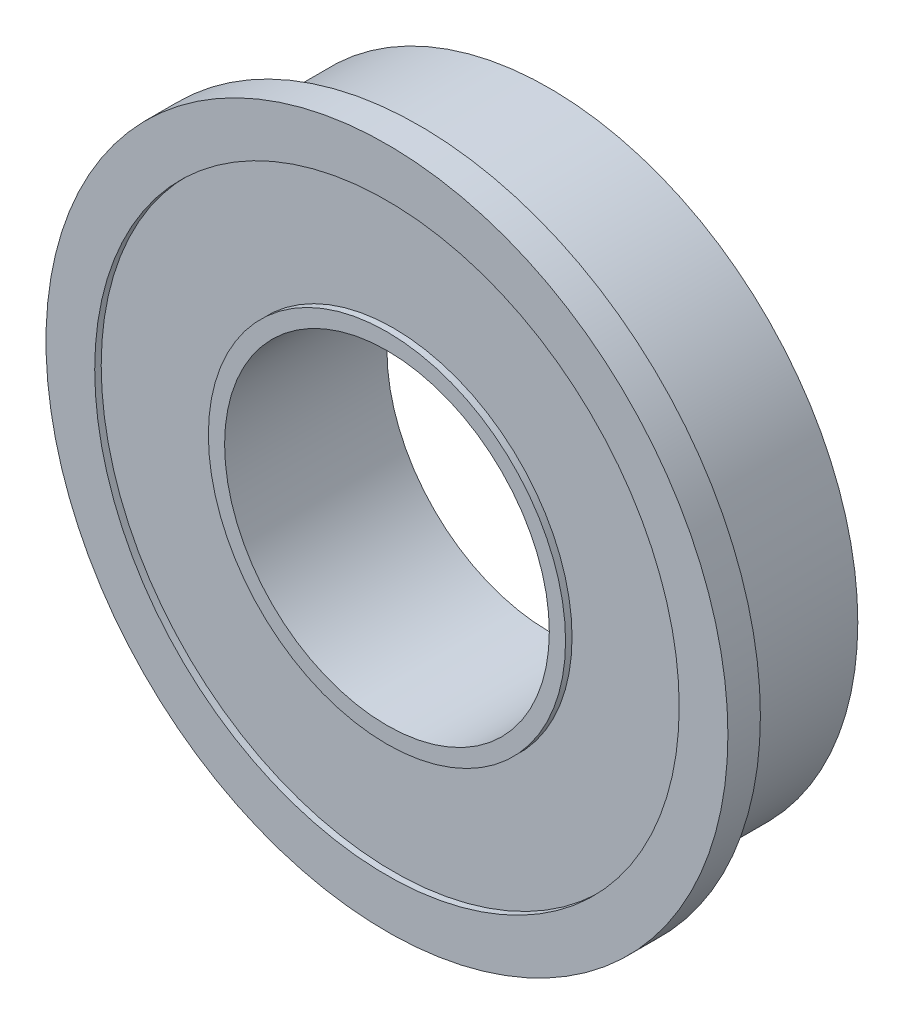
ISO-10303-21;
HEADER;
FILE_DESCRIPTION(('STEP AP214'),'2;1');
FILE_NAME('part.step','',(''),(''),'','','');
FILE_SCHEMA(('AUTOMOTIVE_DESIGN { 1 0 10303 214 1 1 1 1 }'));
ENDSEC;
DATA;
#1=APPLICATION_CONTEXT('core data for automotive mechanical design processes');
#2=APPLICATION_PROTOCOL_DEFINITION('international standard','automotive_design',2000,#1);
#3=PRODUCT_CONTEXT('',#1,'mechanical');
#4=PRODUCT('Part','Part','',(#3));
#5=PRODUCT_RELATED_PRODUCT_CATEGORY('part','',(#4));
#6=PRODUCT_DEFINITION_FORMATION('','',#4);
#7=PRODUCT_DEFINITION_CONTEXT('part definition',#1,'design');
#8=PRODUCT_DEFINITION('design','',#6,#7);
#9=PRODUCT_DEFINITION_SHAPE('','',#8);
#10=(LENGTH_UNIT() NAMED_UNIT(*) SI_UNIT(.MILLI.,.METRE.));
#11=(NAMED_UNIT(*) PLANE_ANGLE_UNIT() SI_UNIT($,.RADIAN.));
#12=(NAMED_UNIT(*) SI_UNIT($,.STERADIAN.) SOLID_ANGLE_UNIT());
#13=UNCERTAINTY_MEASURE_WITH_UNIT(LENGTH_MEASURE(1.E-05),#10,'distance_accuracy_value','');
#14=(GEOMETRIC_REPRESENTATION_CONTEXT(3) GLOBAL_UNCERTAINTY_ASSIGNED_CONTEXT((#13)) GLOBAL_UNIT_ASSIGNED_CONTEXT((#10,
#11,#12)) REPRESENTATION_CONTEXT('',''));
#15=CARTESIAN_POINT('',(0.,0.,0.));
#16=DIRECTION('',(0.,0.,1.));
#17=DIRECTION('',(1.,0.,0.));
#18=AXIS2_PLACEMENT_3D('',#15,#16,#17);
#19=CARTESIAN_POINT('',(0.,0.,1.));
#20=DIRECTION('',(0.,0.,1.));
#21=DIRECTION('',(1.,0.,0.));
#22=AXIS2_PLACEMENT_3D('',#19,#20,#21);
#23=PLANE('',#22);
#24=CARTESIAN_POINT('',(0.,0.,1.));
#25=DIRECTION('',(0.,0.,1.));
#26=DIRECTION('',(1.,0.,0.));
#27=AXIS2_PLACEMENT_3D('',#24,#25,#26);
#28=CIRCLE('',#27,5.);
#29=CARTESIAN_POINT('',(5.,0.,1.));
#30=VERTEX_POINT('',#29);
#31=EDGE_CURVE('E53',#30,#30,#28,.T.);
#32=ORIENTED_EDGE('',*,*,#31,.F.);
#33=EDGE_LOOP('',(#32));
#34=FACE_BOUND('',#33,.T.);
#35=CARTESIAN_POINT('',(0.,0.,1.));
#36=DIRECTION('',(0.,0.,-1.));
#37=DIRECTION('',(-1.,0.,0.));
#38=AXIS2_PLACEMENT_3D('',#35,#36,#37);
#39=CIRCLE('',#38,5.5);
#40=CARTESIAN_POINT('',(-5.5,0.,1.));
#41=VERTEX_POINT('',#40);
#42=EDGE_CURVE('E77',#41,#41,#39,.T.);
#43=ORIENTED_EDGE('',*,*,#42,.F.);
#44=EDGE_LOOP('',(#43));
#45=FACE_BOUND('',#44,.T.);
#46=ADVANCED_FACE('F34',(#34,#45),#23,.T.);
#47=CARTESIAN_POINT('',(0.,0.,-4.));
#48=DIRECTION('',(0.,0.,1.));
#49=DIRECTION('',(1.,0.,0.));
#50=AXIS2_PLACEMENT_3D('',#47,#48,#49);
#51=PLANE('',#50);
#52=CARTESIAN_POINT('',(0.,0.,-4.));
#53=DIRECTION('',(0.,0.,1.));
#54=DIRECTION('',(1.,0.,0.));
#55=AXIS2_PLACEMENT_3D('',#52,#53,#54);
#56=CIRCLE('',#55,5.);
#57=CARTESIAN_POINT('',(5.,0.,-4.));
#58=VERTEX_POINT('',#57);
#59=EDGE_CURVE('E52',#58,#58,#56,.T.);
#60=ORIENTED_EDGE('',*,*,#59,.T.);
#61=EDGE_LOOP('',(#60));
#62=FACE_BOUND('',#61,.T.);
#63=CARTESIAN_POINT('',(0.,0.,-4.));
#64=DIRECTION('',(0.,0.,-1.));
#65=DIRECTION('',(-1.,0.,0.));
#66=AXIS2_PLACEMENT_3D('',#63,#64,#65);
#67=CIRCLE('',#66,5.5);
#68=CARTESIAN_POINT('',(-5.5,0.,-4.));
#69=VERTEX_POINT('',#68);
#70=EDGE_CURVE('E65',#69,#69,#67,.T.);
#71=ORIENTED_EDGE('',*,*,#70,.T.);
#72=EDGE_LOOP('',(#71));
#73=FACE_BOUND('',#72,.T.);
#74=ADVANCED_FACE('F93',(#62,#73),#51,.F.);
#75=CARTESIAN_POINT('',(0.,0.,1.));
#76=DIRECTION('',(0.,0.,-1.));
#77=DIRECTION('',(-1.,0.,0.));
#78=AXIS2_PLACEMENT_3D('',#75,#76,#77);
#79=CIRCLE('',#78,9.);
#80=CARTESIAN_POINT('',(-9.,0.,1.));
#81=VERTEX_POINT('',#80);
#82=EDGE_CURVE('E71',#81,#81,#79,.T.);
#83=ORIENTED_EDGE('',*,*,#82,.T.);
#84=EDGE_LOOP('',(#83));
#85=FACE_BOUND('',#84,.T.);
#86=CARTESIAN_POINT('',(0.,0.,1.));
#87=DIRECTION('',(0.,0.,1.));
#88=DIRECTION('',(1.,0.,0.));
#89=AXIS2_PLACEMENT_3D('',#86,#87,#88);
#90=CIRCLE('',#89,10.5);
#91=CARTESIAN_POINT('',(10.5,0.,1.));
#92=VERTEX_POINT('',#91);
#93=EDGE_CURVE('E10',#92,#92,#90,.T.);
#94=ORIENTED_EDGE('',*,*,#93,.T.);
#95=EDGE_LOOP('',(#94));
#96=FACE_BOUND('',#95,.T.);
#97=ADVANCED_FACE('F96',(#85,#96),#23,.T.);
#98=CARTESIAN_POINT('',(0.,0.,0.));
#99=DIRECTION('',(0.,0.,1.));
#100=DIRECTION('',(1.,0.,0.));
#101=AXIS2_PLACEMENT_3D('',#98,#99,#100);
#102=PLANE('',#101);
#103=CARTESIAN_POINT('',(0.,0.,0.));
#104=DIRECTION('',(0.,0.,1.));
#105=DIRECTION('',(1.,0.,0.));
#106=AXIS2_PLACEMENT_3D('',#103,#104,#105);
#107=CIRCLE('',#106,10.5);
#108=CARTESIAN_POINT('',(10.5,0.,0.));
#109=VERTEX_POINT('',#108);
#110=EDGE_CURVE('E38',#109,#109,#107,.T.);
#111=ORIENTED_EDGE('',*,*,#110,.F.);
#112=EDGE_LOOP('',(#111));
#113=FACE_BOUND('',#112,.T.);
#114=CARTESIAN_POINT('',(0.,0.,0.));
#115=DIRECTION('',(0.,0.,1.));
#116=DIRECTION('',(1.,0.,0.));
#117=AXIS2_PLACEMENT_3D('',#114,#115,#116);
#118=CIRCLE('',#117,9.5);
#119=CARTESIAN_POINT('',(9.5,0.,0.));
#120=VERTEX_POINT('',#119);
#121=EDGE_CURVE('E45',#120,#120,#118,.T.);
#122=ORIENTED_EDGE('',*,*,#121,.T.);
#123=EDGE_LOOP('',(#122));
#124=FACE_BOUND('',#123,.T.);
#125=ADVANCED_FACE('F106',(#113,#124),#102,.F.);
#126=CARTESIAN_POINT('',(0.,0.,1.));
#127=DIRECTION('',(0.,0.,-1.));
#128=DIRECTION('',(-1.,0.,0.));
#129=AXIS2_PLACEMENT_3D('',#126,#127,#128);
#130=CYLINDRICAL_SURFACE('',#129,10.5);
#131=ORIENTED_EDGE('',*,*,#93,.F.);
#132=EDGE_LOOP('',(#131));
#133=FACE_BOUND('',#132,.T.);
#134=ORIENTED_EDGE('',*,*,#110,.T.);
#135=EDGE_LOOP('',(#134));
#136=FACE_BOUND('',#135,.T.);
#137=ADVANCED_FACE('F36',(#133,#136),#130,.T.);
#138=CARTESIAN_POINT('',(0.,0.,-4.));
#139=DIRECTION('',(0.,0.,1.));
#140=DIRECTION('',(1.,0.,0.));
#141=AXIS2_PLACEMENT_3D('',#138,#139,#140);
#142=CYLINDRICAL_SURFACE('',#141,9.5);
#143=CARTESIAN_POINT('',(0.,0.,-4.));
#144=DIRECTION('',(0.,0.,1.));
#145=DIRECTION('',(1.,0.,0.));
#146=AXIS2_PLACEMENT_3D('',#143,#144,#145);
#147=CIRCLE('',#146,9.5);
#148=CARTESIAN_POINT('',(9.5,0.,-4.));
#149=VERTEX_POINT('',#148);
#150=EDGE_CURVE('E49',#149,#149,#147,.T.);
#151=ORIENTED_EDGE('',*,*,#150,.T.);
#152=EDGE_LOOP('',(#151));
#153=FACE_BOUND('',#152,.T.);
#154=ORIENTED_EDGE('',*,*,#121,.F.);
#155=EDGE_LOOP('',(#154));
#156=FACE_BOUND('',#155,.T.);
#157=ADVANCED_FACE('F139',(#153,#156),#142,.T.);
#158=CARTESIAN_POINT('',(0.,0.,-4.));
#159=DIRECTION('',(0.,0.,-1.));
#160=DIRECTION('',(-1.,0.,0.));
#161=AXIS2_PLACEMENT_3D('',#158,#159,#160);
#162=CIRCLE('',#161,9.);
#163=CARTESIAN_POINT('',(-9.,0.,-4.));
#164=VERTEX_POINT('',#163);
#165=EDGE_CURVE('E59',#164,#164,#162,.T.);
#166=ORIENTED_EDGE('',*,*,#165,.F.);
#167=EDGE_LOOP('',(#166));
#168=FACE_BOUND('',#167,.T.);
#169=ORIENTED_EDGE('',*,*,#150,.F.);
#170=EDGE_LOOP('',(#169));
#171=FACE_BOUND('',#170,.T.);
#172=ADVANCED_FACE('F102',(#168,#171),#51,.F.);
#173=CARTESIAN_POINT('',(0.,0.,-4.));
#174=DIRECTION('',(0.,0.,1.));
#175=DIRECTION('',(1.,0.,0.));
#176=AXIS2_PLACEMENT_3D('',#173,#174,#175);
#177=CYLINDRICAL_SURFACE('',#176,5.);
#178=ORIENTED_EDGE('',*,*,#59,.F.);
#179=EDGE_LOOP('',(#178));
#180=FACE_BOUND('',#179,.T.);
#181=ORIENTED_EDGE('',*,*,#31,.T.);
#182=EDGE_LOOP('',(#181));
#183=FACE_BOUND('',#182,.T.);
#184=ADVANCED_FACE('F134',(#180,#183),#177,.F.);
#185=CARTESIAN_POINT('',(0.,0.,-3.8));
#186=DIRECTION('',(0.,0.,-1.));
#187=DIRECTION('',(-1.,0.,0.));
#188=AXIS2_PLACEMENT_3D('',#185,#186,#187);
#189=CYLINDRICAL_SURFACE('',#188,9.);
#190=CARTESIAN_POINT('',(0.,0.,-3.8));
#191=DIRECTION('',(0.,0.,-1.));
#192=DIRECTION('',(-1.,0.,0.));
#193=AXIS2_PLACEMENT_3D('',#190,#191,#192);
#194=CIRCLE('',#193,9.);
#195=CARTESIAN_POINT('',(-9.,0.,-3.8));
#196=VERTEX_POINT('',#195);
#197=EDGE_CURVE('E56',#196,#196,#194,.T.);
#198=ORIENTED_EDGE('',*,*,#197,.F.);
#199=EDGE_LOOP('',(#198));
#200=FACE_BOUND('',#199,.T.);
#201=ORIENTED_EDGE('',*,*,#165,.T.);
#202=EDGE_LOOP('',(#201));
#203=FACE_BOUND('',#202,.T.);
#204=ADVANCED_FACE('F130',(#200,#203),#189,.F.);
#205=CARTESIAN_POINT('',(0.,0.,-3.8));
#206=DIRECTION('',(0.,0.,-1.));
#207=DIRECTION('',(-1.,0.,0.));
#208=AXIS2_PLACEMENT_3D('',#205,#206,#207);
#209=PLANE('',#208);
#210=CARTESIAN_POINT('',(0.,0.,-3.8));
#211=DIRECTION('',(0.,0.,-1.));
#212=DIRECTION('',(-1.,0.,0.));
#213=AXIS2_PLACEMENT_3D('',#210,#211,#212);
#214=CIRCLE('',#213,5.5);
#215=CARTESIAN_POINT('',(-5.5,0.,-3.8));
#216=VERTEX_POINT('',#215);
#217=EDGE_CURVE('E62',#216,#216,#214,.T.);
#218=ORIENTED_EDGE('',*,*,#217,.F.);
#219=EDGE_LOOP('',(#218));
#220=FACE_BOUND('',#219,.T.);
#221=ORIENTED_EDGE('',*,*,#197,.T.);
#222=EDGE_LOOP('',(#221));
#223=FACE_BOUND('',#222,.T.);
#224=ADVANCED_FACE('F126',(#220,#223),#209,.T.);
#225=CARTESIAN_POINT('',(0.,0.,-3.8));
#226=DIRECTION('',(0.,0.,-1.));
#227=DIRECTION('',(-1.,0.,0.));
#228=AXIS2_PLACEMENT_3D('',#225,#226,#227);
#229=CYLINDRICAL_SURFACE('',#228,5.5);
#230=ORIENTED_EDGE('',*,*,#217,.T.);
#231=EDGE_LOOP('',(#230));
#232=FACE_BOUND('',#231,.T.);
#233=ORIENTED_EDGE('',*,*,#70,.F.);
#234=EDGE_LOOP('',(#233));
#235=FACE_BOUND('',#234,.T.);
#236=ADVANCED_FACE('F120',(#232,#235),#229,.T.);
#237=CARTESIAN_POINT('',(0.,0.,0.8));
#238=DIRECTION('',(0.,0.,1.));
#239=DIRECTION('',(-1.,0.,0.));
#240=AXIS2_PLACEMENT_3D('',#237,#238,#239);
#241=PLANE('',#240);
#242=CARTESIAN_POINT('',(0.,0.,0.8));
#243=DIRECTION('',(0.,0.,-1.));
#244=DIRECTION('',(-1.,0.,0.));
#245=AXIS2_PLACEMENT_3D('',#242,#243,#244);
#246=CIRCLE('',#245,9.);
#247=CARTESIAN_POINT('',(-9.,0.,0.8));
#248=VERTEX_POINT('',#247);
#249=EDGE_CURVE('E68',#248,#248,#246,.T.);
#250=ORIENTED_EDGE('',*,*,#249,.F.);
#251=EDGE_LOOP('',(#250));
#252=FACE_BOUND('',#251,.T.);
#253=CARTESIAN_POINT('',(0.,0.,0.8));
#254=DIRECTION('',(0.,0.,-1.));
#255=DIRECTION('',(-1.,0.,0.));
#256=AXIS2_PLACEMENT_3D('',#253,#254,#255);
#257=CIRCLE('',#256,5.5);
#258=CARTESIAN_POINT('',(-5.5,0.,0.8));
#259=VERTEX_POINT('',#258);
#260=EDGE_CURVE('E74',#259,#259,#257,.T.);
#261=ORIENTED_EDGE('',*,*,#260,.T.);
#262=EDGE_LOOP('',(#261));
#263=FACE_BOUND('',#262,.T.);
#264=ADVANCED_FACE('F83',(#252,#263),#241,.T.);
#265=CARTESIAN_POINT('',(0.,0.,0.8));
#266=DIRECTION('',(0.,0.,1.));
#267=DIRECTION('',(1.,0.,0.));
#268=AXIS2_PLACEMENT_3D('',#265,#266,#267);
#269=CYLINDRICAL_SURFACE('',#268,9.);
#270=ORIENTED_EDGE('',*,*,#249,.T.);
#271=EDGE_LOOP('',(#270));
#272=FACE_BOUND('',#271,.T.);
#273=ORIENTED_EDGE('',*,*,#82,.F.);
#274=EDGE_LOOP('',(#273));
#275=FACE_BOUND('',#274,.T.);
#276=ADVANCED_FACE('F88',(#272,#275),#269,.F.);
#277=CARTESIAN_POINT('',(0.,0.,0.8));
#278=DIRECTION('',(0.,0.,1.));
#279=DIRECTION('',(1.,0.,0.));
#280=AXIS2_PLACEMENT_3D('',#277,#278,#279);
#281=CYLINDRICAL_SURFACE('',#280,5.5);
#282=ORIENTED_EDGE('',*,*,#260,.F.);
#283=EDGE_LOOP('',(#282));
#284=FACE_BOUND('',#283,.T.);
#285=ORIENTED_EDGE('',*,*,#42,.T.);
#286=EDGE_LOOP('',(#285));
#287=FACE_BOUND('',#286,.T.);
#288=ADVANCED_FACE('F85',(#284,#287),#281,.T.);
#289=CLOSED_SHELL('',(#46,#74,#97,#125,#137,#157,#172,#184,#204,#224,#236,#264,#276,#288));
#290=MANIFOLD_SOLID_BREP('B2',#289);
#291=ADVANCED_BREP_SHAPE_REPRESENTATION('',(#18,#290),#14);
#292=SHAPE_DEFINITION_REPRESENTATION(#9,#291);
ENDSEC;
END-ISO-10303-21;
